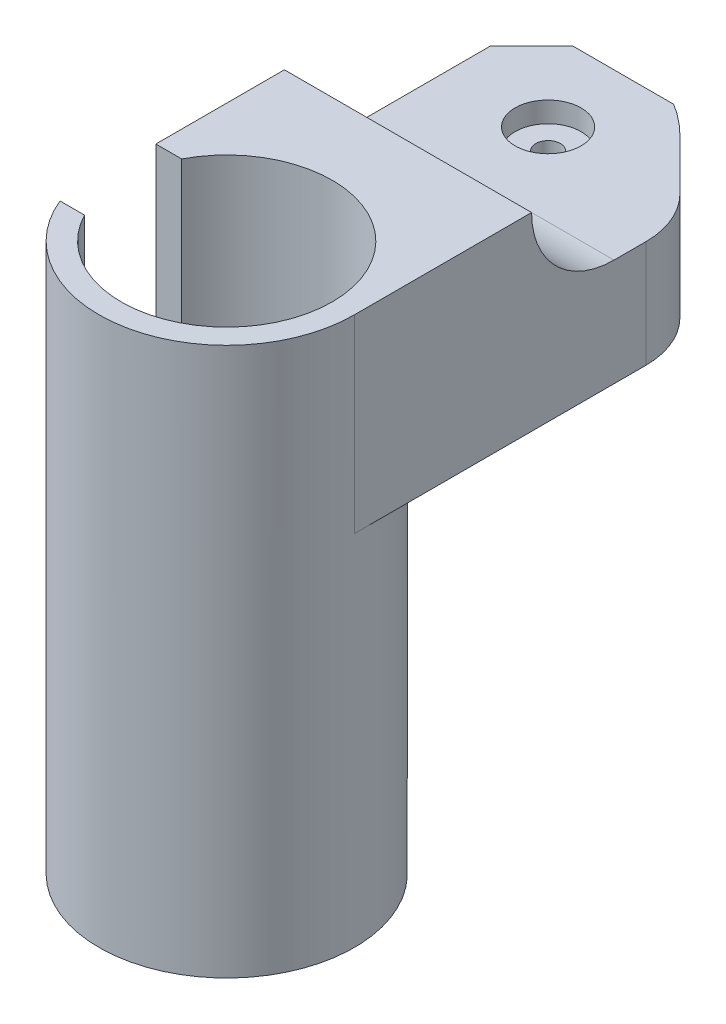
ISO-10303-21;
HEADER;
FILE_DESCRIPTION(('STEP AP214'),'2;1');
FILE_NAME('part.step','',(''),(''),'','','');
FILE_SCHEMA(('AUTOMOTIVE_DESIGN { 1 0 10303 214 1 1 1 1 }'));
ENDSEC;
DATA;
#1=APPLICATION_CONTEXT('core data for automotive mechanical design processes');
#2=APPLICATION_PROTOCOL_DEFINITION('international standard','automotive_design',2000,#1);
#3=PRODUCT_CONTEXT('',#1,'mechanical');
#4=PRODUCT('Part','Part','',(#3));
#5=PRODUCT_RELATED_PRODUCT_CATEGORY('part','',(#4));
#6=PRODUCT_DEFINITION_FORMATION('','',#4);
#7=PRODUCT_DEFINITION_CONTEXT('part definition',#1,'design');
#8=PRODUCT_DEFINITION('design','',#6,#7);
#9=PRODUCT_DEFINITION_SHAPE('','',#8);
#10=(LENGTH_UNIT() NAMED_UNIT(*) SI_UNIT(.MILLI.,.METRE.));
#11=(NAMED_UNIT(*) PLANE_ANGLE_UNIT() SI_UNIT($,.RADIAN.));
#12=(NAMED_UNIT(*) SI_UNIT($,.STERADIAN.) SOLID_ANGLE_UNIT());
#13=UNCERTAINTY_MEASURE_WITH_UNIT(LENGTH_MEASURE(1.E-05),#10,'distance_accuracy_value','');
#14=(GEOMETRIC_REPRESENTATION_CONTEXT(3) GLOBAL_UNCERTAINTY_ASSIGNED_CONTEXT((#13)) GLOBAL_UNIT_ASSIGNED_CONTEXT((#10,
#11,#12)) REPRESENTATION_CONTEXT('',''));
#15=CARTESIAN_POINT('',(0.,0.,0.));
#16=DIRECTION('',(0.,0.,1.));
#17=DIRECTION('',(1.,0.,0.));
#18=AXIS2_PLACEMENT_3D('',#15,#16,#17);
#19=CARTESIAN_POINT('',(-2.49999999999999,68.1,-41.5));
#20=DIRECTION('',(0.,-1.,0.));
#21=DIRECTION('',(1.,0.,0.));
#22=AXIS2_PLACEMENT_3D('',#19,#20,#21);
#23=CYLINDRICAL_SURFACE('',#22,1.5);
#24=CARTESIAN_POINT('',(-2.5,43.,-41.5));
#25=DIRECTION('',(0.,-1.,0.));
#26=DIRECTION('',(1.,0.,0.));
#27=AXIS2_PLACEMENT_3D('',#24,#25,#26);
#28=CIRCLE('',#27,1.5);
#29=CARTESIAN_POINT('',(-0.999999999999997,43.,-41.5));
#30=VERTEX_POINT('',#29);
#31=EDGE_CURVE('E208',#30,#30,#28,.T.);
#32=ORIENTED_EDGE('',*,*,#31,.T.);
#33=EDGE_LOOP('',(#32));
#34=FACE_BOUND('',#33,.T.);
#35=CARTESIAN_POINT('',(-2.49999999999999,50.5,-41.5));
#36=DIRECTION('',(0.,1.,0.));
#37=DIRECTION('',(-1.,0.,0.));
#38=AXIS2_PLACEMENT_3D('',#35,#36,#37);
#39=CIRCLE('',#38,1.5);
#40=CARTESIAN_POINT('',(-3.99999999999999,50.5,-41.5));
#41=VERTEX_POINT('',#40);
#42=EDGE_CURVE('E186',#41,#41,#39,.F.);
#43=ORIENTED_EDGE('',*,*,#42,.F.);
#44=EDGE_LOOP('',(#43));
#45=FACE_BOUND('',#44,.T.);
#46=ADVANCED_FACE('F37',(#34,#45),#23,.F.);
#47=CARTESIAN_POINT('',(15.5,43.,-19.5));
#48=DIRECTION('',(0.,-1.,0.));
#49=DIRECTION('',(-1.,0.,0.));
#50=AXIS2_PLACEMENT_3D('',#47,#48,#49);
#51=PLANE('',#50);
#52=ORIENTED_EDGE('',*,*,#31,.F.);
#53=EDGE_LOOP('',(#52));
#54=FACE_BOUND('',#53,.T.);
#55=CARTESIAN_POINT('',(-2.5,43.,-41.5));
#56=DIRECTION('',(0.,-1.,0.));
#57=DIRECTION('',(1.,0.,0.));
#58=AXIS2_PLACEMENT_3D('',#55,#56,#57);
#59=CIRCLE('',#58,3.5);
#60=CARTESIAN_POINT('',(1.,43.,-41.5));
#61=VERTEX_POINT('',#60);
#62=EDGE_CURVE('E306',#61,#61,#59,.F.);
#63=ORIENTED_EDGE('',*,*,#62,.F.);
#64=EDGE_LOOP('',(#63));
#65=FACE_BOUND('',#64,.T.);
#66=ADVANCED_FACE('F374',(#54,#65),#51,.T.);
#67=CARTESIAN_POINT('',(15.5,0.,0.));
#68=DIRECTION('',(1.,0.,0.));
#69=DIRECTION('',(0.,0.,-1.));
#70=AXIS2_PLACEMENT_3D('',#67,#68,#69);
#71=PLANE('',#70);
#72=DIRECTION('',(0.,1.,0.));
#73=VECTOR('',#72,1.);
#74=CARTESIAN_POINT('',(15.5,0.,0.));
#75=LINE('',#74,#73);
#76=CARTESIAN_POINT('',(15.5,40.,0.));
#77=VERTEX_POINT('',#76);
#78=CARTESIAN_POINT('',(15.5,63.,0.));
#79=VERTEX_POINT('',#78);
#80=EDGE_CURVE('E228',#77,#79,#75,.T.);
#81=ORIENTED_EDGE('',*,*,#80,.F.);
#82=DIRECTION('',(0.,0.,1.));
#83=VECTOR('',#82,1.);
#84=CARTESIAN_POINT('',(15.5,40.,-35.357864376269));
#85=LINE('',#84,#83);
#86=CARTESIAN_POINT('',(15.5,40.,-35.357864376269));
#87=VERTEX_POINT('',#86);
#88=EDGE_CURVE('E200',#87,#77,#85,.T.);
#89=ORIENTED_EDGE('',*,*,#88,.F.);
#90=DIRECTION('',(0.,-1.,0.));
#91=VECTOR('',#90,1.);
#92=CARTESIAN_POINT('',(15.5,21.5,-35.357864376269));
#93=LINE('',#92,#91);
#94=CARTESIAN_POINT('',(15.5,53.,-35.3578643762691));
#95=VERTEX_POINT('',#94);
#96=EDGE_CURVE('E260',#95,#87,#93,.T.);
#97=ORIENTED_EDGE('',*,*,#96,.F.);
#98=DIRECTION('',(0.,0.,1.));
#99=VECTOR('',#98,1.);
#100=CARTESIAN_POINT('',(15.5,53.,0.));
#101=LINE('',#100,#99);
#102=CARTESIAN_POINT('',(15.5,53.,-31.5));
#103=VERTEX_POINT('',#102);
#104=EDGE_CURVE('E203',#95,#103,#101,.T.);
#105=ORIENTED_EDGE('',*,*,#104,.T.);
#106=CARTESIAN_POINT('',(15.5,63.,-31.5));
#107=DIRECTION('',(1.,0.,0.));
#108=DIRECTION('',(0.,0.,-1.));
#109=AXIS2_PLACEMENT_3D('',#106,#107,#108);
#110=CIRCLE('',#109,10.);
#111=CARTESIAN_POINT('',(15.5,63.,-21.5));
#112=VERTEX_POINT('',#111);
#113=EDGE_CURVE('E302',#103,#112,#110,.F.);
#114=ORIENTED_EDGE('',*,*,#113,.T.);
#115=DIRECTION('',(0.,0.,1.));
#116=VECTOR('',#115,1.);
#117=CARTESIAN_POINT('',(15.5,63.,-4.875));
#118=LINE('',#117,#116);
#119=EDGE_CURVE('E215',#112,#79,#118,.T.);
#120=ORIENTED_EDGE('',*,*,#119,.T.);
#121=EDGE_LOOP('',(#81,#89,#97,#105,#114,#120));
#122=FACE_BOUND('',#121,.T.);
#123=ADVANCED_FACE('F336',(#122),#71,.T.);
#124=CARTESIAN_POINT('',(15.5,-3.5,-19.5));
#125=DIRECTION('',(0.,1.,0.));
#126=DIRECTION('',(-1.,0.,0.));
#127=AXIS2_PLACEMENT_3D('',#124,#125,#126);
#128=PLANE('',#127);
#129=CARTESIAN_POINT('',(0.,-3.5,0.));
#130=DIRECTION('',(0.,1.,0.));
#131=DIRECTION('',(-1.,0.,0.));
#132=AXIS2_PLACEMENT_3D('',#129,#130,#131);
#133=CIRCLE('',#132,1.75);
#134=CARTESIAN_POINT('',(1.75,-3.5,0.));
#135=VERTEX_POINT('',#134);
#136=EDGE_CURVE('E216',#135,#135,#133,.T.);
#137=ORIENTED_EDGE('',*,*,#136,.T.);
#138=EDGE_LOOP('',(#137));
#139=FACE_BOUND('',#138,.T.);
#140=DIRECTION('',(-1.,0.,0.));
#141=VECTOR('',#140,1.);
#142=CARTESIAN_POINT('',(-0.306475740290573,-3.5,-5.9));
#143=LINE('',#142,#141);
#144=CARTESIAN_POINT('',(-9.35913729118545,-3.5,-5.9));
#145=VERTEX_POINT('',#144);
#146=CARTESIAN_POINT('',(-14.3331782937351,-3.5,-5.9));
#147=VERTEX_POINT('',#146);
#148=EDGE_CURVE('E229',#145,#147,#143,.T.);
#149=ORIENTED_EDGE('',*,*,#148,.T.);
#150=CARTESIAN_POINT('',(0.,-3.5,0.));
#151=DIRECTION('',(0.,1.,0.));
#152=DIRECTION('',(1.,0.,0.));
#153=AXIS2_PLACEMENT_3D('',#150,#151,#152);
#154=CIRCLE('',#153,15.5);
#155=CARTESIAN_POINT('',(-14.3331782937351,-3.5,5.9));
#156=VERTEX_POINT('',#155);
#157=EDGE_CURVE('E225',#156,#147,#154,.T.);
#158=ORIENTED_EDGE('',*,*,#157,.F.);
#159=DIRECTION('',(1.,0.,0.));
#160=VECTOR('',#159,1.);
#161=CARTESIAN_POINT('',(3.07043135440727,-3.5,5.9));
#162=LINE('',#161,#160);
#163=CARTESIAN_POINT('',(-9.35913729118545,-3.5,5.9));
#164=VERTEX_POINT('',#163);
#165=EDGE_CURVE('E220',#156,#164,#162,.T.);
#166=ORIENTED_EDGE('',*,*,#165,.T.);
#167=DIRECTION('',(0.,0.,-1.));
#168=VECTOR('',#167,1.);
#169=CARTESIAN_POINT('',(-9.35913729118545,-3.5,-12.7));
#170=LINE('',#169,#168);
#171=EDGE_CURVE('E232',#164,#145,#170,.T.);
#172=ORIENTED_EDGE('',*,*,#171,.T.);
#173=EDGE_LOOP('',(#149,#158,#166,#172));
#174=FACE_BOUND('',#173,.T.);
#175=ADVANCED_FACE('F344',(#139,#174),#128,.F.);
#176=CARTESIAN_POINT('',(-16.1129514805811,63.,-5.9));
#177=DIRECTION('',(0.,0.,-1.));
#178=DIRECTION('',(1.,0.,0.));
#179=AXIS2_PLACEMENT_3D('',#176,#177,#178);
#180=PLANE('',#179);
#181=DIRECTION('',(0.,-1.,0.));
#182=VECTOR('',#181,1.);
#183=CARTESIAN_POINT('',(-14.3331782937351,102.436440862009,-5.9));
#184=LINE('',#183,#182);
#185=CARTESIAN_POINT('',(-14.3331782937351,40.,-5.9));
#186=VERTEX_POINT('',#185);
#187=EDGE_CURVE('E297',#147,#186,#184,.F.);
#188=ORIENTED_EDGE('',*,*,#187,.F.);
#189=ORIENTED_EDGE('',*,*,#148,.F.);
#190=DIRECTION('',(0.,-1.,0.));
#191=VECTOR('',#190,1.);
#192=CARTESIAN_POINT('',(-9.35913729118545,63.,-5.9));
#193=LINE('',#192,#191);
#194=CARTESIAN_POINT('',(-9.35913729118545,0.,-5.9));
#195=VERTEX_POINT('',#194);
#196=EDGE_CURVE('E233',#195,#145,#193,.T.);
#197=ORIENTED_EDGE('',*,*,#196,.F.);
#198=DIRECTION('',(1.,0.,0.));
#199=VECTOR('',#198,1.);
#200=CARTESIAN_POINT('',(-8.05647567287533,0.,-5.9));
#201=LINE('',#200,#199);
#202=CARTESIAN_POINT('',(-11.3591372911854,0.,-5.9));
#203=VERTEX_POINT('',#202);
#204=EDGE_CURVE('E272',#203,#195,#201,.T.);
#205=ORIENTED_EDGE('',*,*,#204,.F.);
#206=DIRECTION('',(0.,-1.,0.));
#207=VECTOR('',#206,1.);
#208=CARTESIAN_POINT('',(-11.3591372911854,63.,-5.9));
#209=LINE('',#208,#207);
#210=CARTESIAN_POINT('',(-11.3591372911854,63.,-5.9));
#211=VERTEX_POINT('',#210);
#212=EDGE_CURVE('E256',#211,#203,#209,.T.);
#213=ORIENTED_EDGE('',*,*,#212,.F.);
#214=DIRECTION('',(1.,0.,0.));
#215=VECTOR('',#214,1.);
#216=CARTESIAN_POINT('',(-8.05647574029057,63.,-5.9));
#217=LINE('',#216,#215);
#218=CARTESIAN_POINT('',(-14.5,63.,-5.9));
#219=VERTEX_POINT('',#218);
#220=EDGE_CURVE('E166',#219,#211,#217,.T.);
#221=ORIENTED_EDGE('',*,*,#220,.F.);
#222=DIRECTION('',(0.,-1.,0.));
#223=VECTOR('',#222,1.);
#224=CARTESIAN_POINT('',(-14.5,63.,-5.9));
#225=LINE('',#224,#223);
#226=CARTESIAN_POINT('',(-14.5,40.,-5.9));
#227=VERTEX_POINT('',#226);
#228=EDGE_CURVE('E160',#219,#227,#225,.T.);
#229=ORIENTED_EDGE('',*,*,#228,.T.);
#230=DIRECTION('',(-1.,0.,0.));
#231=VECTOR('',#230,1.);
#232=CARTESIAN_POINT('',(-14.3331782937351,40.,-5.9));
#233=LINE('',#232,#231);
#234=EDGE_CURVE('E164',#186,#227,#233,.T.);
#235=ORIENTED_EDGE('',*,*,#234,.F.);
#236=EDGE_LOOP('',(#188,#189,#197,#205,#213,#221,#229,#235));
#237=FACE_BOUND('',#236,.T.);
#238=ADVANCED_FACE('F162',(#237),#180,.F.);
#239=CARTESIAN_POINT('',(0.,63.,0.));
#240=DIRECTION('',(0.,1.,0.));
#241=DIRECTION('',(0.,0.,1.));
#242=AXIS2_PLACEMENT_3D('',#239,#240,#241);
#243=PLANE('',#242);
#244=ORIENTED_EDGE('',*,*,#119,.F.);
#245=DIRECTION('',(-1.,0.,0.));
#246=VECTOR('',#245,1.);
#247=CARTESIAN_POINT('',(0.,63.,-21.5));
#248=LINE('',#247,#246);
#249=CARTESIAN_POINT('',(-14.5,63.,-21.5));
#250=VERTEX_POINT('',#249);
#251=EDGE_CURVE('E206',#112,#250,#248,.T.);
#252=ORIENTED_EDGE('',*,*,#251,.T.);
#253=DIRECTION('',(0.,0.,-1.));
#254=VECTOR('',#253,1.);
#255=CARTESIAN_POINT('',(-14.5,63.,0.));
#256=LINE('',#255,#254);
#257=EDGE_CURVE('E168',#219,#250,#256,.T.);
#258=ORIENTED_EDGE('',*,*,#257,.F.);
#259=ORIENTED_EDGE('',*,*,#220,.T.);
#260=CARTESIAN_POINT('',(0.,63.,0.));
#261=DIRECTION('',(0.,-1.,0.));
#262=DIRECTION('',(-1.,0.,0.));
#263=AXIS2_PLACEMENT_3D('',#260,#261,#262);
#264=CIRCLE('',#263,12.8);
#265=CARTESIAN_POINT('',(-11.3591372911854,63.,5.9));
#266=VERTEX_POINT('',#265);
#267=EDGE_CURVE('E238',#211,#266,#264,.T.);
#268=ORIENTED_EDGE('',*,*,#267,.T.);
#269=DIRECTION('',(-1.,0.,0.));
#270=VECTOR('',#269,1.);
#271=CARTESIAN_POINT('',(-4.67956864559273,63.,5.9));
#272=LINE('',#271,#270);
#273=CARTESIAN_POINT('',(-14.3331782937351,63.,5.9));
#274=VERTEX_POINT('',#273);
#275=EDGE_CURVE('E240',#266,#274,#272,.T.);
#276=ORIENTED_EDGE('',*,*,#275,.T.);
#277=CARTESIAN_POINT('',(0.,63.,0.));
#278=DIRECTION('',(0.,1.,0.));
#279=DIRECTION('',(1.,0.,0.));
#280=AXIS2_PLACEMENT_3D('',#277,#278,#279);
#281=CIRCLE('',#280,15.5);
#282=EDGE_CURVE('E247',#274,#79,#281,.T.);
#283=ORIENTED_EDGE('',*,*,#282,.T.);
#284=EDGE_LOOP('',(#244,#252,#258,#259,#268,#276,#283));
#285=FACE_BOUND('',#284,.T.);
#286=ADVANCED_FACE('F359',(#285),#243,.T.);
#287=CARTESIAN_POINT('',(5.5,21.5,-35.357864376269));
#288=DIRECTION('',(0.,1.,0.));
#289=DIRECTION('',(0.923879532511287,0.,-0.38268343236509));
#290=AXIS2_PLACEMENT_3D('',#287,#288,#289);
#291=CYLINDRICAL_SURFACE('',#290,10.);
#292=CARTESIAN_POINT('',(5.5,53.,-35.357864376269));
#293=DIRECTION('',(0.,-1.,0.));
#294=DIRECTION('',(0.923879532511287,0.,-0.38268343236509));
#295=AXIS2_PLACEMENT_3D('',#292,#293,#294);
#296=CIRCLE('',#295,10.);
#297=CARTESIAN_POINT('',(12.5710678118655,53.,-42.4289321881345));
#298=VERTEX_POINT('',#297);
#299=EDGE_CURVE('E251',#298,#95,#296,.T.);
#300=ORIENTED_EDGE('',*,*,#299,.T.);
#301=ORIENTED_EDGE('',*,*,#96,.T.);
#302=CARTESIAN_POINT('',(5.5,40.,-35.357864376269));
#303=DIRECTION('',(0.,-1.,0.));
#304=DIRECTION('',(1.,0.,0.));
#305=AXIS2_PLACEMENT_3D('',#302,#303,#304);
#306=CIRCLE('',#305,10.);
#307=CARTESIAN_POINT('',(12.5710678118655,40.,-42.4289321881345));
#308=VERTEX_POINT('',#307);
#309=EDGE_CURVE('E197',#308,#87,#306,.T.);
#310=ORIENTED_EDGE('',*,*,#309,.F.);
#311=DIRECTION('',(0.,1.,0.));
#312=VECTOR('',#311,1.);
#313=CARTESIAN_POINT('',(12.5710678118655,21.5,-42.4289321881345));
#314=LINE('',#313,#312);
#315=EDGE_CURVE('E248',#308,#298,#314,.T.);
#316=ORIENTED_EDGE('',*,*,#315,.T.);
#317=EDGE_LOOP('',(#300,#301,#310,#316));
#318=FACE_BOUND('',#317,.T.);
#319=ADVANCED_FACE('F332',(#318),#291,.T.);
#320=CARTESIAN_POINT('',(-14.5,0.,0.));
#321=DIRECTION('',(-1.,0.,0.));
#322=DIRECTION('',(0.,0.,1.));
#323=AXIS2_PLACEMENT_3D('',#320,#321,#322);
#324=PLANE('',#323);
#325=DIRECTION('',(0.,0.,-1.));
#326=VECTOR('',#325,1.);
#327=CARTESIAN_POINT('',(-14.5,53.,-19.5));
#328=LINE('',#327,#326);
#329=CARTESIAN_POINT('',(-14.5,53.,-31.5));
#330=VERTEX_POINT('',#329);
#331=CARTESIAN_POINT('',(-14.5,53.,-46.5));
#332=VERTEX_POINT('',#331);
#333=EDGE_CURVE('E213',#330,#332,#328,.T.);
#334=ORIENTED_EDGE('',*,*,#333,.T.);
#335=DIRECTION('',(0.,-1.,0.));
#336=VECTOR('',#335,1.);
#337=CARTESIAN_POINT('',(-14.5,40.,-46.5));
#338=LINE('',#337,#336);
#339=CARTESIAN_POINT('',(-14.5,40.,-46.5));
#340=VERTEX_POINT('',#339);
#341=EDGE_CURVE('E45',#332,#340,#338,.T.);
#342=ORIENTED_EDGE('',*,*,#341,.T.);
#343=DIRECTION('',(0.,0.,-1.));
#344=VECTOR('',#343,1.);
#345=CARTESIAN_POINT('',(-14.5,40.,-5.9));
#346=LINE('',#345,#344);
#347=EDGE_CURVE('E171',#227,#340,#346,.T.);
#348=ORIENTED_EDGE('',*,*,#347,.F.);
#349=ORIENTED_EDGE('',*,*,#228,.F.);
#350=ORIENTED_EDGE('',*,*,#257,.T.);
#351=CARTESIAN_POINT('',(-14.5,63.,-31.5));
#352=DIRECTION('',(-1.,0.,0.));
#353=DIRECTION('',(0.,0.,1.));
#354=AXIS2_PLACEMENT_3D('',#351,#352,#353);
#355=CIRCLE('',#354,10.);
#356=EDGE_CURVE('E304',#250,#330,#355,.F.);
#357=ORIENTED_EDGE('',*,*,#356,.T.);
#358=EDGE_LOOP('',(#334,#342,#348,#349,#350,#357));
#359=FACE_BOUND('',#358,.T.);
#360=ADVANCED_FACE('F172',(#359),#324,.T.);
#361=CARTESIAN_POINT('',(-6.69669914110089,53.,-45.8884849389084));
#362=DIRECTION('',(0.,1.,0.));
#363=DIRECTION('',(0.,0.,1.));
#364=AXIS2_PLACEMENT_3D('',#361,#362,#363);
#365=PLANE('',#364);
#366=CARTESIAN_POINT('',(-2.49999999999999,53.,-41.5));
#367=DIRECTION('',(0.,1.,0.));
#368=DIRECTION('',(-1.,0.,0.));
#369=AXIS2_PLACEMENT_3D('',#366,#367,#368);
#370=CIRCLE('',#369,4.);
#371=CARTESIAN_POINT('',(-6.49999999999999,53.,-41.5));
#372=VERTEX_POINT('',#371);
#373=EDGE_CURVE('E453',#372,#372,#370,.T.);
#374=ORIENTED_EDGE('',*,*,#373,.F.);
#375=EDGE_LOOP('',(#374));
#376=FACE_BOUND('',#375,.T.);
#377=DIRECTION('',(1.,0.,0.));
#378=VECTOR('',#377,1.);
#379=CARTESIAN_POINT('',(-14.5,53.,-51.5));
#380=LINE('',#379,#378);
#381=CARTESIAN_POINT('',(-9.50000000000001,53.,-51.5));
#382=VERTEX_POINT('',#381);
#383=CARTESIAN_POINT('',(2.75138250539081,53.,-51.5));
#384=VERTEX_POINT('',#383);
#385=EDGE_CURVE('E169',#382,#384,#380,.T.);
#386=ORIENTED_EDGE('',*,*,#385,.F.);
#387=DIRECTION('',(-0.707106781186546,0.,0.707106781186549));
#388=VECTOR('',#387,1.);
#389=CARTESIAN_POINT('',(-10.9041071010963,53.,-50.0958928989038));
#390=LINE('',#389,#388);
#391=EDGE_CURVE('E59',#382,#332,#390,.T.);
#392=ORIENTED_EDGE('',*,*,#391,.T.);
#393=ORIENTED_EDGE('',*,*,#333,.F.);
#394=DIRECTION('',(1.,0.,0.));
#395=VECTOR('',#394,1.);
#396=CARTESIAN_POINT('',(15.5,53.,-31.5));
#397=LINE('',#396,#395);
#398=EDGE_CURVE('E299',#330,#103,#397,.T.);
#399=ORIENTED_EDGE('',*,*,#398,.T.);
#400=ORIENTED_EDGE('',*,*,#104,.F.);
#401=ORIENTED_EDGE('',*,*,#299,.F.);
#402=DIRECTION('',(-0.707106781186548,0.,-0.707106781186548));
#403=VECTOR('',#402,1.);
#404=CARTESIAN_POINT('',(0.500000000000012,53.,-54.5));
#405=LINE('',#404,#403);
#406=CARTESIAN_POINT('',(6.35786437626905,53.,-48.642135623731));
#407=VERTEX_POINT('',#406);
#408=EDGE_CURVE('E219',#298,#407,#405,.T.);
#409=ORIENTED_EDGE('',*,*,#408,.T.);
#410=CARTESIAN_POINT('',(-7.78427124746192,53.,-34.5));
#411=DIRECTION('',(0.,1.,0.));
#412=DIRECTION('',(-1.,0.,0.));
#413=AXIS2_PLACEMENT_3D('',#410,#411,#412);
#414=CIRCLE('',#413,20.);
#415=EDGE_CURVE('E291',#407,#384,#414,.T.);
#416=ORIENTED_EDGE('',*,*,#415,.T.);
#417=EDGE_LOOP('',(#386,#392,#393,#399,#400,#401,#409,#416));
#418=FACE_BOUND('',#417,.T.);
#419=ADVANCED_FACE('F321',(#376,#418),#365,.T.);
#420=CARTESIAN_POINT('',(-9.35913729118545,63.,-5.9));
#421=DIRECTION('',(1.,0.,0.));
#422=DIRECTION('',(0.,0.,1.));
#423=AXIS2_PLACEMENT_3D('',#420,#421,#422);
#424=PLANE('',#423);
#425=DIRECTION('',(0.,0.,1.));
#426=VECTOR('',#425,1.);
#427=CARTESIAN_POINT('',(-9.35913729118545,0.,-5.88075955233941));
#428=LINE('',#427,#426);
#429=CARTESIAN_POINT('',(-9.35913729118545,0.,5.9));
#430=VERTEX_POINT('',#429);
#431=EDGE_CURVE('E224',#195,#430,#428,.T.);
#432=ORIENTED_EDGE('',*,*,#431,.F.);
#433=ORIENTED_EDGE('',*,*,#196,.T.);
#434=ORIENTED_EDGE('',*,*,#171,.F.);
#435=DIRECTION('',(0.,-1.,0.));
#436=VECTOR('',#435,1.);
#437=CARTESIAN_POINT('',(-9.35913729118545,63.,5.9));
#438=LINE('',#437,#436);
#439=EDGE_CURVE('E237',#430,#164,#438,.T.);
#440=ORIENTED_EDGE('',*,*,#439,.F.);
#441=EDGE_LOOP('',(#432,#433,#434,#440));
#442=FACE_BOUND('',#441,.T.);
#443=ADVANCED_FACE('F348',(#442),#424,.F.);
#444=CARTESIAN_POINT('',(-9.35913729118545,63.,5.9));
#445=DIRECTION('',(0.,0.,1.));
#446=DIRECTION('',(-1.,0.,0.));
#447=AXIS2_PLACEMENT_3D('',#444,#445,#446);
#448=PLANE('',#447);
#449=DIRECTION('',(-1.,0.,0.));
#450=VECTOR('',#449,1.);
#451=CARTESIAN_POINT('',(-4.67956857817748,0.,5.9));
#452=LINE('',#451,#450);
#453=CARTESIAN_POINT('',(-11.3591372911854,0.,5.9));
#454=VERTEX_POINT('',#453);
#455=EDGE_CURVE('E221',#430,#454,#452,.T.);
#456=ORIENTED_EDGE('',*,*,#455,.F.);
#457=ORIENTED_EDGE('',*,*,#439,.T.);
#458=ORIENTED_EDGE('',*,*,#165,.F.);
#459=DIRECTION('',(0.,-1.,0.));
#460=VECTOR('',#459,1.);
#461=CARTESIAN_POINT('',(-14.3331782937351,0.,5.9));
#462=LINE('',#461,#460);
#463=EDGE_CURVE('E261',#274,#156,#462,.T.);
#464=ORIENTED_EDGE('',*,*,#463,.F.);
#465=ORIENTED_EDGE('',*,*,#275,.F.);
#466=DIRECTION('',(0.,1.,0.));
#467=VECTOR('',#466,1.);
#468=CARTESIAN_POINT('',(-11.3591372911854,63.,5.9));
#469=LINE('',#468,#467);
#470=EDGE_CURVE('E266',#454,#266,#469,.T.);
#471=ORIENTED_EDGE('',*,*,#470,.F.);
#472=EDGE_LOOP('',(#456,#457,#458,#464,#465,#471));
#473=FACE_BOUND('',#472,.T.);
#474=ADVANCED_FACE('F398',(#473),#448,.F.);
#475=CARTESIAN_POINT('',(1.3483048785447E-07,0.,-5.86151910467881));
#476=DIRECTION('',(0.,1.,0.));
#477=DIRECTION('',(0.,0.,1.));
#478=AXIS2_PLACEMENT_3D('',#475,#476,#477);
#479=PLANE('',#478);
#480=CARTESIAN_POINT('',(0.,0.,0.));
#481=DIRECTION('',(0.,1.,0.));
#482=DIRECTION('',(-1.,0.,0.));
#483=AXIS2_PLACEMENT_3D('',#480,#481,#482);
#484=CIRCLE('',#483,4.75);
#485=CARTESIAN_POINT('',(4.75,0.,0.));
#486=VERTEX_POINT('',#485);
#487=EDGE_CURVE('E227',#486,#486,#484,.T.);
#488=ORIENTED_EDGE('',*,*,#487,.F.);
#489=EDGE_LOOP('',(#488));
#490=FACE_BOUND('',#489,.T.);
#491=CARTESIAN_POINT('',(0.,0.,0.));
#492=DIRECTION('',(0.,-1.,0.));
#493=DIRECTION('',(-1.,0.,0.));
#494=AXIS2_PLACEMENT_3D('',#491,#492,#493);
#495=CIRCLE('',#494,12.8);
#496=EDGE_CURVE('E263',#203,#454,#495,.T.);
#497=ORIENTED_EDGE('',*,*,#496,.F.);
#498=ORIENTED_EDGE('',*,*,#204,.T.);
#499=ORIENTED_EDGE('',*,*,#431,.T.);
#500=ORIENTED_EDGE('',*,*,#455,.T.);
#501=EDGE_LOOP('',(#497,#498,#499,#500));
#502=FACE_BOUND('',#501,.T.);
#503=ADVANCED_FACE('F352',(#490,#502),#479,.T.);
#504=CARTESIAN_POINT('',(15.5,43.,-39.5));
#505=DIRECTION('',(0.707106781186548,0.,-0.707106781186548));
#506=DIRECTION('',(-0.707106781186548,0.,-0.707106781186548));
#507=AXIS2_PLACEMENT_3D('',#504,#505,#506);
#508=PLANE('',#507);
#509=ORIENTED_EDGE('',*,*,#315,.F.);
#510=DIRECTION('',(0.707106781186549,0.,0.707106781186546));
#511=VECTOR('',#510,1.);
#512=CARTESIAN_POINT('',(6.35786437626904,40.,-48.642135623731));
#513=LINE('',#512,#511);
#514=CARTESIAN_POINT('',(6.35786437626903,40.,-48.6421356237309));
#515=VERTEX_POINT('',#514);
#516=EDGE_CURVE('E194',#515,#308,#513,.T.);
#517=ORIENTED_EDGE('',*,*,#516,.F.);
#518=DIRECTION('',(0.,1.,0.));
#519=VECTOR('',#518,1.);
#520=CARTESIAN_POINT('',(6.35786437626903,43.,-48.642135623731));
#521=LINE('',#520,#519);
#522=EDGE_CURVE('E244',#515,#407,#521,.T.);
#523=ORIENTED_EDGE('',*,*,#522,.T.);
#524=ORIENTED_EDGE('',*,*,#408,.F.);
#525=EDGE_LOOP('',(#509,#517,#523,#524));
#526=FACE_BOUND('',#525,.T.);
#527=ADVANCED_FACE('F328',(#526),#508,.T.);
#528=CARTESIAN_POINT('',(0.,-3.,0.));
#529=DIRECTION('',(0.,-1.,0.));
#530=DIRECTION('',(0.,0.,-1.));
#531=AXIS2_PLACEMENT_3D('',#528,#529,#530);
#532=TOROIDAL_SURFACE('',#531,4.75,3.);
#533=CARTESIAN_POINT('',(0.,-3.,0.));
#534=DIRECTION('',(0.,-1.,0.));
#535=DIRECTION('',(-1.,0.,0.));
#536=AXIS2_PLACEMENT_3D('',#533,#534,#535);
#537=CIRCLE('',#536,1.75);
#538=CARTESIAN_POINT('',(1.75,-3.,0.));
#539=VERTEX_POINT('',#538);
#540=EDGE_CURVE('E257',#539,#539,#537,.T.);
#541=ORIENTED_EDGE('',*,*,#540,.T.);
#542=EDGE_LOOP('',(#541));
#543=FACE_BOUND('',#542,.T.);
#544=ORIENTED_EDGE('',*,*,#487,.T.);
#545=EDGE_LOOP('',(#544));
#546=FACE_BOUND('',#545,.T.);
#547=ADVANCED_FACE('F406',(#543,#546),#532,.T.);
#548=CARTESIAN_POINT('',(0.,-3.5,0.));
#549=DIRECTION('',(0.,-1.,0.));
#550=DIRECTION('',(-1.,0.,0.));
#551=AXIS2_PLACEMENT_3D('',#548,#549,#550);
#552=CYLINDRICAL_SURFACE('',#551,1.75);
#553=ORIENTED_EDGE('',*,*,#136,.F.);
#554=EDGE_LOOP('',(#553));
#555=FACE_BOUND('',#554,.T.);
#556=ORIENTED_EDGE('',*,*,#540,.F.);
#557=EDGE_LOOP('',(#556));
#558=FACE_BOUND('',#557,.T.);
#559=ADVANCED_FACE('F392',(#555,#558),#552,.F.);
#560=CARTESIAN_POINT('',(0.,0.,0.));
#561=DIRECTION('',(0.,-1.,0.));
#562=DIRECTION('',(1.,0.,0.));
#563=AXIS2_PLACEMENT_3D('',#560,#561,#562);
#564=CYLINDRICAL_SURFACE('',#563,15.5);
#565=CARTESIAN_POINT('',(0.,40.,0.));
#566=DIRECTION('',(0.,1.,0.));
#567=DIRECTION('',(1.,0.,0.));
#568=AXIS2_PLACEMENT_3D('',#565,#566,#567);
#569=CIRCLE('',#568,15.5);
#570=EDGE_CURVE('E182',#77,#186,#569,.T.);
#571=ORIENTED_EDGE('',*,*,#570,.F.);
#572=ORIENTED_EDGE('',*,*,#80,.T.);
#573=ORIENTED_EDGE('',*,*,#282,.F.);
#574=ORIENTED_EDGE('',*,*,#463,.T.);
#575=ORIENTED_EDGE('',*,*,#157,.T.);
#576=ORIENTED_EDGE('',*,*,#187,.T.);
#577=EDGE_LOOP('',(#571,#572,#573,#574,#575,#576));
#578=FACE_BOUND('',#577,.T.);
#579=ADVANCED_FACE('F340',(#578),#564,.T.);
#580=CARTESIAN_POINT('',(0.,63.,0.));
#581=DIRECTION('',(0.,-1.,0.));
#582=DIRECTION('',(-1.,0.,0.));
#583=AXIS2_PLACEMENT_3D('',#580,#581,#582);
#584=CYLINDRICAL_SURFACE('',#583,12.8);
#585=ORIENTED_EDGE('',*,*,#496,.T.);
#586=ORIENTED_EDGE('',*,*,#470,.T.);
#587=ORIENTED_EDGE('',*,*,#267,.F.);
#588=ORIENTED_EDGE('',*,*,#212,.T.);
#589=EDGE_LOOP('',(#585,#586,#587,#588));
#590=FACE_BOUND('',#589,.T.);
#591=ADVANCED_FACE('F355',(#590),#584,.F.);
#592=CARTESIAN_POINT('',(-7.78427124746193,43.,-34.5));
#593=DIRECTION('',(0.,1.,0.));
#594=DIRECTION('',(-1.,0.,0.));
#595=AXIS2_PLACEMENT_3D('',#592,#593,#594);
#596=CYLINDRICAL_SURFACE('',#595,20.);
#597=DIRECTION('',(0.,1.,0.));
#598=VECTOR('',#597,1.);
#599=CARTESIAN_POINT('',(2.75138250539081,43.,-51.5));
#600=LINE('',#599,#598);
#601=CARTESIAN_POINT('',(2.75138250539081,40.,-51.5));
#602=VERTEX_POINT('',#601);
#603=EDGE_CURVE('E294',#384,#602,#600,.F.);
#604=ORIENTED_EDGE('',*,*,#603,.F.);
#605=ORIENTED_EDGE('',*,*,#415,.F.);
#606=ORIENTED_EDGE('',*,*,#522,.F.);
#607=CARTESIAN_POINT('',(-7.78427124746193,40.,-34.5));
#608=DIRECTION('',(0.,-1.,0.));
#609=DIRECTION('',(1.,0.,0.));
#610=AXIS2_PLACEMENT_3D('',#607,#608,#609);
#611=CIRCLE('',#610,20.);
#612=EDGE_CURVE('E191',#602,#515,#611,.T.);
#613=ORIENTED_EDGE('',*,*,#612,.F.);
#614=EDGE_LOOP('',(#604,#605,#606,#613));
#615=FACE_BOUND('',#614,.T.);
#616=ADVANCED_FACE('F324',(#615),#596,.T.);
#617=CARTESIAN_POINT('',(-14.5,43.,-51.5));
#618=DIRECTION('',(0.,0.,1.));
#619=DIRECTION('',(1.,0.,0.));
#620=AXIS2_PLACEMENT_3D('',#617,#618,#619);
#621=PLANE('',#620);
#622=DIRECTION('',(1.,0.,0.));
#623=VECTOR('',#622,1.);
#624=CARTESIAN_POINT('',(-14.5,40.,-51.5));
#625=LINE('',#624,#623);
#626=CARTESIAN_POINT('',(-9.50000000000001,40.,-51.5));
#627=VERTEX_POINT('',#626);
#628=EDGE_CURVE('E175',#627,#602,#625,.T.);
#629=ORIENTED_EDGE('',*,*,#628,.F.);
#630=DIRECTION('',(0.,1.,0.));
#631=VECTOR('',#630,1.);
#632=CARTESIAN_POINT('',(-9.50000000000001,53.,-51.5));
#633=LINE('',#632,#631);
#634=EDGE_CURVE('E309',#627,#382,#633,.T.);
#635=ORIENTED_EDGE('',*,*,#634,.T.);
#636=ORIENTED_EDGE('',*,*,#385,.T.);
#637=ORIENTED_EDGE('',*,*,#603,.T.);
#638=EDGE_LOOP('',(#629,#635,#636,#637));
#639=FACE_BOUND('',#638,.T.);
#640=ADVANCED_FACE('F318',(#639),#621,.F.);
#641=CARTESIAN_POINT('',(-6.69669914110089,63.,-31.5));
#642=DIRECTION('',(-1.,0.,0.));
#643=DIRECTION('',(0.,-1.,0.));
#644=AXIS2_PLACEMENT_3D('',#641,#642,#643);
#645=CYLINDRICAL_SURFACE('',#644,10.);
#646=ORIENTED_EDGE('',*,*,#356,.F.);
#647=ORIENTED_EDGE('',*,*,#251,.F.);
#648=ORIENTED_EDGE('',*,*,#113,.F.);
#649=ORIENTED_EDGE('',*,*,#398,.F.);
#650=EDGE_LOOP('',(#646,#647,#648,#649));
#651=FACE_BOUND('',#650,.T.);
#652=ADVANCED_FACE('F364',(#651),#645,.F.);
#653=CARTESIAN_POINT('',(-7.78427124746193,40.,-34.5));
#654=DIRECTION('',(0.,-1.,0.));
#655=DIRECTION('',(1.,0.,0.));
#656=AXIS2_PLACEMENT_3D('',#653,#654,#655);
#657=PLANE('',#656);
#658=ORIENTED_EDGE('',*,*,#347,.T.);
#659=DIRECTION('',(0.707106781186546,0.,-0.707106781186549));
#660=VECTOR('',#659,1.);
#661=CARTESIAN_POINT('',(-17.142135623731,40.,-43.857864376269));
#662=LINE('',#661,#660);
#663=EDGE_CURVE('E11',#340,#627,#662,.T.);
#664=ORIENTED_EDGE('',*,*,#663,.T.);
#665=ORIENTED_EDGE('',*,*,#628,.T.);
#666=ORIENTED_EDGE('',*,*,#612,.T.);
#667=ORIENTED_EDGE('',*,*,#516,.T.);
#668=ORIENTED_EDGE('',*,*,#309,.T.);
#669=ORIENTED_EDGE('',*,*,#88,.T.);
#670=ORIENTED_EDGE('',*,*,#570,.T.);
#671=ORIENTED_EDGE('',*,*,#234,.T.);
#672=EDGE_LOOP('',(#658,#664,#665,#666,#667,#668,#669,#670,#671));
#673=FACE_BOUND('',#672,.T.);
#674=CARTESIAN_POINT('',(-2.5,40.,-41.5));
#675=DIRECTION('',(0.,-1.,0.));
#676=DIRECTION('',(1.,0.,0.));
#677=AXIS2_PLACEMENT_3D('',#674,#675,#676);
#678=CIRCLE('',#677,3.5);
#679=CARTESIAN_POINT('',(1.,40.,-41.5));
#680=VERTEX_POINT('',#679);
#681=EDGE_CURVE('E183',#680,#680,#678,.T.);
#682=ORIENTED_EDGE('',*,*,#681,.F.);
#683=EDGE_LOOP('',(#682));
#684=FACE_BOUND('',#683,.T.);
#685=ADVANCED_FACE('F178',(#673,#684),#657,.T.);
#686=CARTESIAN_POINT('',(-2.5,40.,-41.5));
#687=DIRECTION('',(0.,1.,0.));
#688=DIRECTION('',(-1.,0.,0.));
#689=AXIS2_PLACEMENT_3D('',#686,#687,#688);
#690=CYLINDRICAL_SURFACE('',#689,3.5);
#691=ORIENTED_EDGE('',*,*,#681,.T.);
#692=EDGE_LOOP('',(#691));
#693=FACE_BOUND('',#692,.T.);
#694=ORIENTED_EDGE('',*,*,#62,.T.);
#695=EDGE_LOOP('',(#694));
#696=FACE_BOUND('',#695,.T.);
#697=ADVANCED_FACE('F434',(#693,#696),#690,.F.);
#698=CARTESIAN_POINT('',(-2.49999999999999,50.5,-41.5));
#699=DIRECTION('',(0.,1.,0.));
#700=DIRECTION('',(-1.,0.,0.));
#701=AXIS2_PLACEMENT_3D('',#698,#699,#700);
#702=PLANE('',#701);
#703=CARTESIAN_POINT('',(-2.49999999999999,50.5,-41.5));
#704=DIRECTION('',(0.,1.,0.));
#705=DIRECTION('',(-1.,0.,0.));
#706=AXIS2_PLACEMENT_3D('',#703,#704,#705);
#707=CIRCLE('',#706,4.);
#708=CARTESIAN_POINT('',(-6.5,50.5,-41.5));
#709=VERTEX_POINT('',#708);
#710=EDGE_CURVE('E312',#709,#709,#707,.T.);
#711=ORIENTED_EDGE('',*,*,#710,.T.);
#712=EDGE_LOOP('',(#711));
#713=FACE_BOUND('',#712,.T.);
#714=ORIENTED_EDGE('',*,*,#42,.T.);
#715=EDGE_LOOP('',(#714));
#716=FACE_BOUND('',#715,.T.);
#717=ADVANCED_FACE('F370',(#713,#716),#702,.T.);
#718=CARTESIAN_POINT('',(-2.49999999999999,50.5,-41.5));
#719=DIRECTION('',(0.,1.,0.));
#720=DIRECTION('',(-1.,0.,0.));
#721=AXIS2_PLACEMENT_3D('',#718,#719,#720);
#722=CYLINDRICAL_SURFACE('',#721,4.);
#723=ORIENTED_EDGE('',*,*,#710,.F.);
#724=EDGE_LOOP('',(#723));
#725=FACE_BOUND('',#724,.T.);
#726=ORIENTED_EDGE('',*,*,#373,.T.);
#727=EDGE_LOOP('',(#726));
#728=FACE_BOUND('',#727,.T.);
#729=ADVANCED_FACE('F366',(#725,#728),#722,.F.);
#730=CARTESIAN_POINT('',(-9.50000000000001,43.,-51.5));
#731=DIRECTION('',(-0.707106781186549,0.,-0.707106781186546));
#732=DIRECTION('',(0.,-1.,0.));
#733=AXIS2_PLACEMENT_3D('',#730,#731,#732);
#734=PLANE('',#733);
#735=ORIENTED_EDGE('',*,*,#663,.F.);
#736=ORIENTED_EDGE('',*,*,#341,.F.);
#737=ORIENTED_EDGE('',*,*,#391,.F.);
#738=ORIENTED_EDGE('',*,*,#634,.F.);
#739=EDGE_LOOP('',(#735,#736,#737,#738));
#740=FACE_BOUND('',#739,.T.);
#741=ADVANCED_FACE('F39',(#740),#734,.T.);
#742=CLOSED_SHELL('',(#46,#66,#123,#175,#238,#286,#319,#360,#419,#443,#474,#503,#527,#547,#559,
#579,#591,#616,#640,#652,#685,#697,#717,#729,#741));
#743=MANIFOLD_SOLID_BREP('B2',#742);
#744=ADVANCED_BREP_SHAPE_REPRESENTATION('',(#18,#743),#14);
#745=SHAPE_DEFINITION_REPRESENTATION(#9,#744);
ENDSEC;
END-ISO-10303-21;
